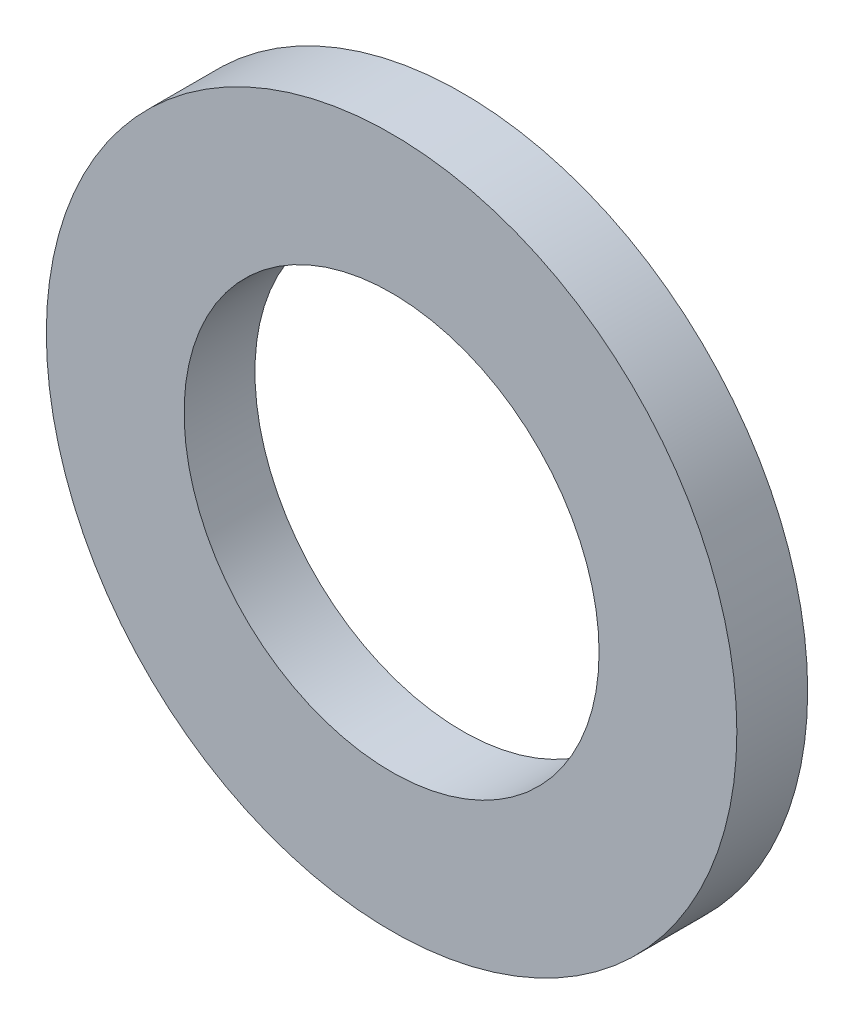
ISO-10303-21;
HEADER;
FILE_DESCRIPTION(('STEP AP214'),'2;1');
FILE_NAME('part.step','',(''),(''),'','','');
FILE_SCHEMA(('AUTOMOTIVE_DESIGN { 1 0 10303 214 1 1 1 1 }'));
ENDSEC;
DATA;
#1=APPLICATION_CONTEXT('core data for automotive mechanical design processes');
#2=APPLICATION_PROTOCOL_DEFINITION('international standard','automotive_design',2000,#1);
#3=PRODUCT_CONTEXT('',#1,'mechanical');
#4=PRODUCT('Part','Part','',(#3));
#5=PRODUCT_RELATED_PRODUCT_CATEGORY('part','',(#4));
#6=PRODUCT_DEFINITION_FORMATION('','',#4);
#7=PRODUCT_DEFINITION_CONTEXT('part definition',#1,'design');
#8=PRODUCT_DEFINITION('design','',#6,#7);
#9=PRODUCT_DEFINITION_SHAPE('','',#8);
#10=(LENGTH_UNIT() NAMED_UNIT(*) SI_UNIT(.MILLI.,.METRE.));
#11=(NAMED_UNIT(*) PLANE_ANGLE_UNIT() SI_UNIT($,.RADIAN.));
#12=(NAMED_UNIT(*) SI_UNIT($,.STERADIAN.) SOLID_ANGLE_UNIT());
#13=UNCERTAINTY_MEASURE_WITH_UNIT(LENGTH_MEASURE(1.E-05),#10,'distance_accuracy_value','');
#14=(GEOMETRIC_REPRESENTATION_CONTEXT(3) GLOBAL_UNCERTAINTY_ASSIGNED_CONTEXT((#13)) GLOBAL_UNIT_ASSIGNED_CONTEXT((#10,
#11,#12)) REPRESENTATION_CONTEXT('',''));
#15=CARTESIAN_POINT('',(0.,0.,0.));
#16=DIRECTION('',(0.,0.,1.));
#17=DIRECTION('',(1.,0.,0.));
#18=AXIS2_PLACEMENT_3D('',#15,#16,#17);
#19=CARTESIAN_POINT('',(0.,0.,0.8128));
#20=DIRECTION('',(0.,0.,1.));
#21=DIRECTION('',(1.,0.,0.));
#22=AXIS2_PLACEMENT_3D('',#19,#20,#21);
#23=PLANE('',#22);
#24=CARTESIAN_POINT('',(0.,0.,0.8128));
#25=DIRECTION('',(0.,0.,1.));
#26=DIRECTION('',(1.,0.,0.));
#27=AXIS2_PLACEMENT_3D('',#24,#25,#26);
#28=CIRCLE('',#27,3.9624);
#29=CARTESIAN_POINT('',(3.9624,0.,0.8128));
#30=VERTEX_POINT('',#29);
#31=EDGE_CURVE('E10',#30,#30,#28,.T.);
#32=ORIENTED_EDGE('',*,*,#31,.T.);
#33=EDGE_LOOP('',(#32));
#34=FACE_BOUND('',#33,.T.);
#35=CARTESIAN_POINT('',(0.,0.,0.8128));
#36=DIRECTION('',(0.,0.,1.));
#37=DIRECTION('',(1.,0.,0.));
#38=AXIS2_PLACEMENT_3D('',#35,#36,#37);
#39=CIRCLE('',#38,2.38125);
#40=CARTESIAN_POINT('',(2.38125,0.,0.8128));
#41=VERTEX_POINT('',#40);
#42=EDGE_CURVE('E50',#41,#41,#39,.T.);
#43=ORIENTED_EDGE('',*,*,#42,.F.);
#44=EDGE_LOOP('',(#43));
#45=FACE_BOUND('',#44,.T.);
#46=ADVANCED_FACE('F37',(#34,#45),#23,.T.);
#47=CARTESIAN_POINT('',(0.,0.,0.));
#48=DIRECTION('',(0.,0.,1.));
#49=DIRECTION('',(1.,0.,0.));
#50=AXIS2_PLACEMENT_3D('',#47,#48,#49);
#51=PLANE('',#50);
#52=CARTESIAN_POINT('',(0.,0.,0.));
#53=DIRECTION('',(0.,0.,1.));
#54=DIRECTION('',(1.,0.,0.));
#55=AXIS2_PLACEMENT_3D('',#52,#53,#54);
#56=CIRCLE('',#55,3.9624);
#57=CARTESIAN_POINT('',(3.9624,0.,0.));
#58=VERTEX_POINT('',#57);
#59=EDGE_CURVE('E41',#58,#58,#56,.T.);
#60=ORIENTED_EDGE('',*,*,#59,.F.);
#61=EDGE_LOOP('',(#60));
#62=FACE_BOUND('',#61,.T.);
#63=CARTESIAN_POINT('',(0.,0.,0.));
#64=DIRECTION('',(0.,0.,1.));
#65=DIRECTION('',(1.,0.,0.));
#66=AXIS2_PLACEMENT_3D('',#63,#64,#65);
#67=CIRCLE('',#66,2.38125);
#68=CARTESIAN_POINT('',(2.38125,0.,0.));
#69=VERTEX_POINT('',#68);
#70=EDGE_CURVE('E52',#69,#69,#67,.T.);
#71=ORIENTED_EDGE('',*,*,#70,.T.);
#72=EDGE_LOOP('',(#71));
#73=FACE_BOUND('',#72,.T.);
#74=ADVANCED_FACE('F64',(#62,#73),#51,.F.);
#75=CARTESIAN_POINT('',(0.,0.,0.8128));
#76=DIRECTION('',(0.,0.,-1.));
#77=DIRECTION('',(-1.,0.,0.));
#78=AXIS2_PLACEMENT_3D('',#75,#76,#77);
#79=CYLINDRICAL_SURFACE('',#78,3.9624);
#80=ORIENTED_EDGE('',*,*,#31,.F.);
#81=EDGE_LOOP('',(#80));
#82=FACE_BOUND('',#81,.T.);
#83=ORIENTED_EDGE('',*,*,#59,.T.);
#84=EDGE_LOOP('',(#83));
#85=FACE_BOUND('',#84,.T.);
#86=ADVANCED_FACE('F39',(#82,#85),#79,.T.);
#87=CARTESIAN_POINT('',(0.,0.,0.8128));
#88=DIRECTION('',(0.,0.,-1.));
#89=DIRECTION('',(-1.,0.,0.));
#90=AXIS2_PLACEMENT_3D('',#87,#88,#89);
#91=CYLINDRICAL_SURFACE('',#90,2.38125);
#92=ORIENTED_EDGE('',*,*,#42,.T.);
#93=EDGE_LOOP('',(#92));
#94=FACE_BOUND('',#93,.T.);
#95=ORIENTED_EDGE('',*,*,#70,.F.);
#96=EDGE_LOOP('',(#95));
#97=FACE_BOUND('',#96,.T.);
#98=ADVANCED_FACE('F60',(#94,#97),#91,.F.);
#99=CLOSED_SHELL('',(#46,#74,#86,#98));
#100=MANIFOLD_SOLID_BREP('B2',#99);
#101=ADVANCED_BREP_SHAPE_REPRESENTATION('',(#18,#100),#14);
#102=SHAPE_DEFINITION_REPRESENTATION(#9,#101);
ENDSEC;
END-ISO-10303-21;
